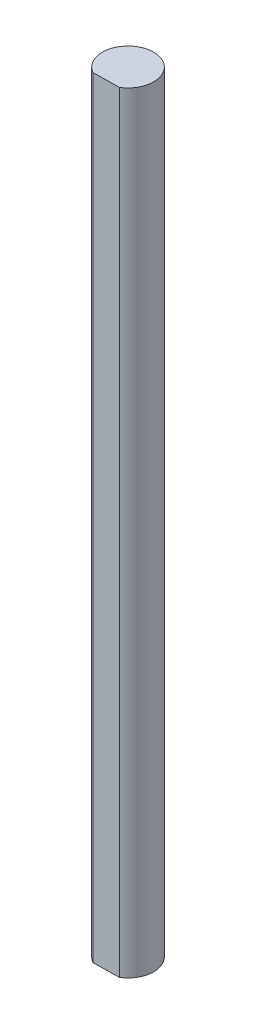
ISO-10303-21;
HEADER;
FILE_DESCRIPTION(('STEP AP214'),'2;1');
FILE_NAME('part.step','',(''),(''),'','','');
FILE_SCHEMA(('AUTOMOTIVE_DESIGN { 1 0 10303 214 1 1 1 1 }'));
ENDSEC;
DATA;
#1=APPLICATION_CONTEXT('core data for automotive mechanical design processes');
#2=APPLICATION_PROTOCOL_DEFINITION('international standard','automotive_design',2000,#1);
#3=PRODUCT_CONTEXT('',#1,'mechanical');
#4=PRODUCT('Part','Part','',(#3));
#5=PRODUCT_RELATED_PRODUCT_CATEGORY('part','',(#4));
#6=PRODUCT_DEFINITION_FORMATION('','',#4);
#7=PRODUCT_DEFINITION_CONTEXT('part definition',#1,'design');
#8=PRODUCT_DEFINITION('design','',#6,#7);
#9=PRODUCT_DEFINITION_SHAPE('','',#8);
#10=(LENGTH_UNIT() NAMED_UNIT(*) SI_UNIT(.MILLI.,.METRE.));
#11=(NAMED_UNIT(*) PLANE_ANGLE_UNIT() SI_UNIT($,.RADIAN.));
#12=(NAMED_UNIT(*) SI_UNIT($,.STERADIAN.) SOLID_ANGLE_UNIT());
#13=UNCERTAINTY_MEASURE_WITH_UNIT(LENGTH_MEASURE(1.E-05),#10,'distance_accuracy_value','');
#14=(GEOMETRIC_REPRESENTATION_CONTEXT(3) GLOBAL_UNCERTAINTY_ASSIGNED_CONTEXT((#13)) GLOBAL_UNIT_ASSIGNED_CONTEXT((#10,
#11,#12)) REPRESENTATION_CONTEXT('',''));
#15=CARTESIAN_POINT('',(0.,0.,0.));
#16=DIRECTION('',(0.,0.,1.));
#17=DIRECTION('',(1.,0.,0.));
#18=AXIS2_PLACEMENT_3D('',#15,#16,#17);
#19=CARTESIAN_POINT('',(0.,60.,0.));
#20=DIRECTION('',(0.,-1.,0.));
#21=DIRECTION('',(0.,0.,-1.));
#22=AXIS2_PLACEMENT_3D('',#19,#20,#21);
#23=CYLINDRICAL_SURFACE('',#22,2.);
#24=DIRECTION('',(0.,1.,0.));
#25=VECTOR('',#24,1.);
#26=CARTESIAN_POINT('',(-0.979211600376985,0.,1.74388779503933));
#27=LINE('',#26,#25);
#28=CARTESIAN_POINT('',(-0.979211600376985,0.,1.74388779503933));
#29=VERTEX_POINT('',#28);
#30=CARTESIAN_POINT('',(-0.979211600376985,60.,1.74388779503933));
#31=VERTEX_POINT('',#30);
#32=EDGE_CURVE('E49',#29,#31,#27,.T.);
#33=ORIENTED_EDGE('',*,*,#32,.T.);
#34=CARTESIAN_POINT('',(0.,60.,0.));
#35=DIRECTION('',(0.,1.,0.));
#36=DIRECTION('',(0.,0.,1.));
#37=AXIS2_PLACEMENT_3D('',#34,#35,#36);
#38=CIRCLE('',#37,2.);
#39=CARTESIAN_POINT('',(1.03635645067138,60.,1.71054532449503));
#40=VERTEX_POINT('',#39);
#41=EDGE_CURVE('E11',#40,#31,#38,.T.);
#42=ORIENTED_EDGE('',*,*,#41,.F.);
#43=DIRECTION('',(0.,1.,0.));
#44=VECTOR('',#43,1.);
#45=CARTESIAN_POINT('',(1.03635645067138,0.,1.71054532449503));
#46=LINE('',#45,#44);
#47=CARTESIAN_POINT('',(1.03635645067138,0.,1.71054532449503));
#48=VERTEX_POINT('',#47);
#49=EDGE_CURVE('E61',#48,#40,#46,.T.);
#50=ORIENTED_EDGE('',*,*,#49,.F.);
#51=CARTESIAN_POINT('',(0.,0.,0.));
#52=DIRECTION('',(0.,1.,0.));
#53=DIRECTION('',(0.,0.,1.));
#54=AXIS2_PLACEMENT_3D('',#51,#52,#53);
#55=CIRCLE('',#54,2.);
#56=EDGE_CURVE('E38',#48,#29,#55,.T.);
#57=ORIENTED_EDGE('',*,*,#56,.T.);
#58=EDGE_LOOP('',(#33,#42,#50,#57));
#59=FACE_BOUND('',#58,.T.);
#60=ADVANCED_FACE('F35',(#59),#23,.T.);
#61=CARTESIAN_POINT('',(0.,60.,0.));
#62=DIRECTION('',(0.,1.,0.));
#63=DIRECTION('',(0.,0.,1.));
#64=AXIS2_PLACEMENT_3D('',#61,#62,#63);
#65=PLANE('',#64);
#66=ORIENTED_EDGE('',*,*,#41,.T.);
#67=DIRECTION('',(0.999863201447542,0.,-0.0165402052911362));
#68=VECTOR('',#67,1.);
#69=CARTESIAN_POINT('',(0.0285724251471996,60.,1.72721655976718));
#70=LINE('',#69,#68);
#71=EDGE_CURVE('E59',#31,#40,#70,.T.);
#72=ORIENTED_EDGE('',*,*,#71,.T.);
#73=EDGE_LOOP('',(#66,#72));
#74=FACE_BOUND('',#73,.T.);
#75=ADVANCED_FACE('F69',(#74),#65,.T.);
#76=CARTESIAN_POINT('',(0.,0.,0.));
#77=DIRECTION('',(0.,1.,0.));
#78=DIRECTION('',(0.,0.,1.));
#79=AXIS2_PLACEMENT_3D('',#76,#77,#78);
#80=PLANE('',#79);
#81=DIRECTION('',(0.999863201447542,0.,-0.0165402052911362));
#82=VECTOR('',#81,1.);
#83=CARTESIAN_POINT('',(0.0285724251471996,0.,1.72721655976718));
#84=LINE('',#83,#82);
#85=EDGE_CURVE('E54',#29,#48,#84,.T.);
#86=ORIENTED_EDGE('',*,*,#85,.F.);
#87=ORIENTED_EDGE('',*,*,#56,.F.);
#88=EDGE_LOOP('',(#86,#87));
#89=FACE_BOUND('',#88,.T.);
#90=ADVANCED_FACE('F71',(#89),#80,.F.);
#91=CARTESIAN_POINT('',(0.0285724251471996,0.,1.72721655976718));
#92=DIRECTION('',(0.0165402052911362,0.,0.999863201447542));
#93=DIRECTION('',(0.999863201447542,0.,-0.0165402052911362));
#94=AXIS2_PLACEMENT_3D('',#91,#92,#93);
#95=PLANE('',#94);
#96=ORIENTED_EDGE('',*,*,#71,.F.);
#97=ORIENTED_EDGE('',*,*,#32,.F.);
#98=ORIENTED_EDGE('',*,*,#85,.T.);
#99=ORIENTED_EDGE('',*,*,#49,.T.);
#100=EDGE_LOOP('',(#96,#97,#98,#99));
#101=FACE_BOUND('',#100,.T.);
#102=ADVANCED_FACE('F60',(#101),#95,.T.);
#103=CLOSED_SHELL('',(#60,#75,#90,#102));
#104=MANIFOLD_SOLID_BREP('B2',#103);
#105=ADVANCED_BREP_SHAPE_REPRESENTATION('',(#18,#104),#14);
#106=SHAPE_DEFINITION_REPRESENTATION(#9,#105);
ENDSEC;
END-ISO-10303-21;
